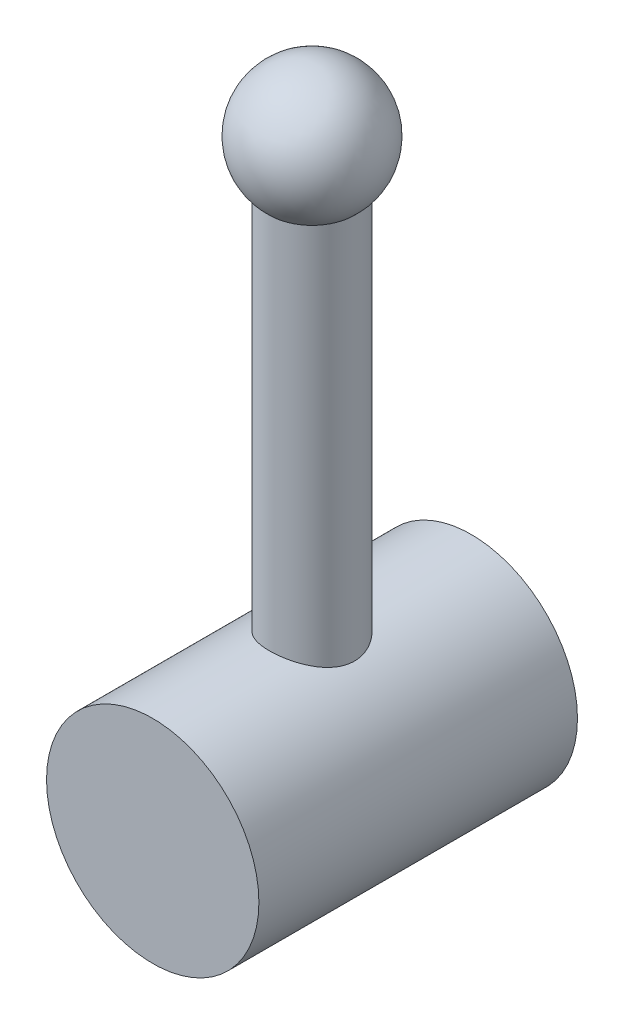
ISO-10303-21;
HEADER;
FILE_DESCRIPTION(('STEP AP214'),'2;1');
FILE_NAME('part.step','',(''),(''),'','','');
FILE_SCHEMA(('AUTOMOTIVE_DESIGN { 1 0 10303 214 1 1 1 1 }'));
ENDSEC;
DATA;
#1=APPLICATION_CONTEXT('core data for automotive mechanical design processes');
#2=APPLICATION_PROTOCOL_DEFINITION('international standard','automotive_design',2000,#1);
#3=PRODUCT_CONTEXT('',#1,'mechanical');
#4=PRODUCT('Part','Part','',(#3));
#5=PRODUCT_RELATED_PRODUCT_CATEGORY('part','',(#4));
#6=PRODUCT_DEFINITION_FORMATION('','',#4);
#7=PRODUCT_DEFINITION_CONTEXT('part definition',#1,'design');
#8=PRODUCT_DEFINITION('design','',#6,#7);
#9=PRODUCT_DEFINITION_SHAPE('','',#8);
#10=(LENGTH_UNIT() NAMED_UNIT(*) SI_UNIT(.MILLI.,.METRE.));
#11=(NAMED_UNIT(*) PLANE_ANGLE_UNIT() SI_UNIT($,.RADIAN.));
#12=(NAMED_UNIT(*) SI_UNIT($,.STERADIAN.) SOLID_ANGLE_UNIT());
#13=UNCERTAINTY_MEASURE_WITH_UNIT(LENGTH_MEASURE(1.E-05),#10,'distance_accuracy_value','');
#14=(GEOMETRIC_REPRESENTATION_CONTEXT(3) GLOBAL_UNCERTAINTY_ASSIGNED_CONTEXT((#13)) GLOBAL_UNIT_ASSIGNED_CONTEXT((#10,
#11,#12)) REPRESENTATION_CONTEXT('',''));
#15=CARTESIAN_POINT('',(0.,0.,0.));
#16=DIRECTION('',(0.,0.,1.));
#17=DIRECTION('',(1.,0.,0.));
#18=AXIS2_PLACEMENT_3D('',#15,#16,#17);
#19=CARTESIAN_POINT('',(0.,50.,15.));
#20=DIRECTION('',(0.,-1.,0.));
#21=DIRECTION('',(0.,0.,-1.));
#22=AXIS2_PLACEMENT_3D('',#19,#20,#21);
#23=CYLINDRICAL_SURFACE('',#22,4.);
#24=CARTESIAN_POINT('',(0.,10.,11.));
#25=CARTESIAN_POINT('',(-0.107549581345536,9.99999886871264,11.0000015749329));
#26=CARTESIAN_POINT('',(-0.215132147940361,9.99825999367799,11.0043436710802));
#27=CARTESIAN_POINT('',(-0.429535200549548,9.99134740691108,11.0216733827839));
#28=CARTESIAN_POINT('',(-0.5363551627033,9.98617152790588,11.0346664534026));
#29=CARTESIAN_POINT('',(-0.748635856497415,9.97250573560117,11.0692080345506));
#30=CARTESIAN_POINT('',(-0.854093134440868,9.96400865312144,11.0907750546198));
#31=CARTESIAN_POINT('',(-1.0626676111401,9.94393017211574,11.1422417304368));
#32=CARTESIAN_POINT('',(-1.16578384227259,9.932347522545,11.1721447662553));
#33=CARTESIAN_POINT('',(-1.46979509681069,9.89349112162205,11.273722808716));
#34=CARTESIAN_POINT('',(-1.66629107461992,9.86204458846134,11.3574218190064));
#35=CARTESIAN_POINT('',(-2.04217417878102,9.79113035538708,11.5540462173498));
#36=CARTESIAN_POINT('',(-2.22156721456798,9.75166544086262,11.6669614601149));
#37=CARTESIAN_POINT('',(-2.56699339938209,9.66661825353092,11.9244687545217));
#38=CARTESIAN_POINT('',(-2.73212223266508,9.62084608086599,12.0702127105756));
#39=CARTESIAN_POINT('',(-3.03635232313263,9.52921139577231,12.386800609152));
#40=CARTESIAN_POINT('',(-3.17544084661153,9.48334885017047,12.5576567590165));
#41=CARTESIAN_POINT('',(-3.42974847409894,9.39445587657958,12.9288559685663));
#42=CARTESIAN_POINT('',(-3.54362978572887,9.35164233015934,13.1301729260637));
#43=CARTESIAN_POINT('',(-3.73550961465234,9.2766729328807,13.5510728428009));
#44=CARTESIAN_POINT('',(-3.81352517485723,9.24451202207146,13.7706470677414));
#45=CARTESIAN_POINT('',(-3.92779760260541,9.19652715590089,14.2114246556858));
#46=CARTESIAN_POINT('',(-3.96578791979826,9.18002840771385,14.4321024680881));
#47=CARTESIAN_POINT('',(-4.00434593508728,9.16328008038143,14.8772699996773));
#48=CARTESIAN_POINT('',(-4.00493203570086,9.16302251073203,15.1017577900111));
#49=CARTESIAN_POINT('',(-3.9699787321474,9.17821000534301,15.5315133422232));
#50=CARTESIAN_POINT('',(-3.93695062778272,9.19256349925666,15.7370314287656));
#51=CARTESIAN_POINT('',(-3.83989376129508,9.23352375055553,16.1393191123503));
#52=CARTESIAN_POINT('',(-3.77585958980135,9.26013264599921,16.3360871763063));
#53=CARTESIAN_POINT('',(-3.6173894649114,9.32318970221162,16.7200356722919));
#54=CARTESIAN_POINT('',(-3.52235972457939,9.35982758573424,16.9069384780825));
#55=CARTESIAN_POINT('',(-3.30501292151569,9.43876232767927,17.26283163275));
#56=CARTESIAN_POINT('',(-3.1826856102159,9.48106130910412,17.4318152188131));
#57=CARTESIAN_POINT('',(-2.90310119889356,9.57053473488081,17.760819457596));
#58=CARTESIAN_POINT('',(-2.74387492593717,9.61783329953252,17.9191374588899));
#59=CARTESIAN_POINT('',(-2.40062885486449,9.70919649915614,18.2073689560062));
#60=CARTESIAN_POINT('',(-2.21660413066998,9.75326048890393,18.3372767948212));
#61=CARTESIAN_POINT('',(-1.82415530521056,9.83429362529359,18.5672348948311));
#62=CARTESIAN_POINT('',(-1.61532098269266,9.87110540190899,18.6666445623939));
#63=CARTESIAN_POINT('',(-1.18204753096606,9.93229656657448,18.8283357221563));
#64=CARTESIAN_POINT('',(-0.957616393699402,9.95668226924746,18.8906360751149));
#65=CARTESIAN_POINT('',(-0.513791775215594,9.98912279013839,18.9728965908394));
#66=CARTESIAN_POINT('',(-0.294886587971144,9.99805891667034,18.9951449085071));
#67=CARTESIAN_POINT('',(0.143690619615703,10.0013695702126,19.0034262010573));
#68=CARTESIAN_POINT('',(0.36336242644818,9.99574787164577,18.9894685630952));
#69=CARTESIAN_POINT('',(0.786865478243653,9.97115134127512,18.9274164948959));
#70=CARTESIAN_POINT('',(0.99096498354976,9.95278782691064,18.8808840392975));
#71=CARTESIAN_POINT('',(1.38827085612275,9.90518882810983,18.757128583381));
#72=CARTESIAN_POINT('',(1.58147582045412,9.87595194712999,18.6799016406648));
#73=CARTESIAN_POINT('',(1.95815757162884,9.80833189541687,18.4944301206379));
#74=CARTESIAN_POINT('',(2.14115604549353,9.76969631959847,18.3853090559053));
#75=CARTESIAN_POINT('',(2.4868871825104,9.68746729490809,18.1401193521971));
#76=CARTESIAN_POINT('',(2.64961168158684,9.64387186219643,18.0040399141861));
#77=CARTESIAN_POINT('',(2.96144608598878,9.55290235277181,17.6982599740674));
#78=CARTESIAN_POINT('',(3.10894786734725,9.50546882853787,17.5269329168592));
#79=CARTESIAN_POINT('',(3.37350239509234,9.41483345830581,17.1611198341097));
#80=CARTESIAN_POINT('',(3.4905501236659,9.37163231039242,16.9666299998006));
#81=CARTESIAN_POINT('',(3.69161500286277,9.2942859982933,16.5570766103267));
#82=CARTESIAN_POINT('',(3.77530118531766,9.26023261821741,16.3418319997565));
#83=CARTESIAN_POINT('',(3.90459244315908,9.20647346903737,15.8985326983872));
#84=CARTESIAN_POINT('',(3.95022562452798,9.18675711197461,15.6704875951582));
#85=CARTESIAN_POINT('',(3.99943122157416,9.16543518780389,15.225744190156));
#86=CARTESIAN_POINT('',(4.0057941177721,9.16262842667612,15.009410298105));
#87=CARTESIAN_POINT('',(3.98360636538274,9.17229671415009,14.5789103072789));
#88=CARTESIAN_POINT('',(3.9550601501471,9.18476982225497,14.3647439367175));
#89=CARTESIAN_POINT('',(3.86614256488129,9.2225330048627,13.9533355391097));
#90=CARTESIAN_POINT('',(3.80707437387706,9.2472967218297,13.7557591537789));
#91=CARTESIAN_POINT('',(3.66001151041638,9.30647993934966,13.3732430382103));
#92=CARTESIAN_POINT('',(3.5720088493455,9.34090210615105,13.1883068148887));
#93=CARTESIAN_POINT('',(3.36374310804133,9.41797252826471,12.8247795892905));
#94=CARTESIAN_POINT('',(3.24192140926543,9.46097893410836,12.6471581693117));
#95=CARTESIAN_POINT('',(2.97179350239177,9.54927479921251,12.3140178573752));
#96=CARTESIAN_POINT('',(2.82347931168581,9.59456494363941,12.15850565271));
#97=CARTESIAN_POINT('',(2.492974124467,9.68587647140965,11.8635764074694));
#98=CARTESIAN_POINT('',(2.30921017071955,9.73175488236393,11.7258566160177));
#99=CARTESIAN_POINT('',(2.01716584575533,9.7949502762577,11.5439518910625));
#100=CARTESIAN_POINT('',(1.91699501972425,9.81509269692655,11.487392936147));
#101=CARTESIAN_POINT('',(1.7118011098248,9.85294835133019,11.3829620045947));
#102=CARTESIAN_POINT('',(1.60678027559742,9.87066269647665,11.335086050192));
#103=CARTESIAN_POINT('',(1.39454646904328,9.9028559935491,11.249252015315));
#104=CARTESIAN_POINT('',(1.28740777135872,9.91738778532477,11.2111298452528));
#105=CARTESIAN_POINT('',(1.06995577523383,9.94319722915714,11.1440786522787));
#106=CARTESIAN_POINT('',(0.95964398335262,9.95447639837582,11.1151453426501));
#107=CARTESIAN_POINT('',(0.736945215856839,9.97343330649399,11.066825163851));
#108=CARTESIAN_POINT('',(0.624564263591285,9.98112017494336,11.047414088355));
#109=CARTESIAN_POINT('',(0.398419132407607,9.99270031578293,11.0182614293338));
#110=CARTESIAN_POINT('',(0.284655994966355,9.99659628445551,11.0085129731657));
#111=CARTESIAN_POINT('',(0.113830463425493,9.99951445883957,11.0012141044266));
#112=CARTESIAN_POINT('',(0.0569198512645304,10.0000005987258,10.9999991664779));
#113=CARTESIAN_POINT('',(0.,10.,11.));
#114=B_SPLINE_CURVE_WITH_KNOTS('',3,(#24,#25,#26,#27,#28,#29,#30,#31,#32,#33,#34,#35,#36,#37,
#38,#39,#40,#41,#42,#43,#44,#45,#46,#47,#48,#49,#50,#51,#52,#53,#54,#55,#56,#57,#58,#59,#60,#61,
#62,#63,#64,#65,#66,#67,#68,#69,#70,#71,#72,#73,#74,#75,#76,#77,#78,#79,#80,#81,#82,#83,#84,#85,
#86,#87,#88,#89,#90,#91,#92,#93,#94,#95,#96,#97,#98,#99,#100,#101,#102,#103,#104,#105,#106,#107,
#108,#109,#110,#111,#112,#113),.UNSPECIFIED.,.T.,.F.,(4,2,2,2,2,2,2,2,2,2,2,2,2,2,2,2,2,2,2,2,2,
2,2,2,2,2,2,2,2,2,2,2,2,2,2,2,2,2,2,2,2,2,2,2,4),(0.,0.322603993422155,0.645411604786481,
0.968919914471234,1.29255959093094,1.93701523385824,2.58124739027476,3.25313995292302,
3.9253602176033,4.62749749529941,5.32930078128043,5.99927442509165,6.66891844572483,
7.29195888698822,7.9151080641227,8.55097484497806,9.18708075776541,9.87235930273289,
10.5577741757964,11.2567305822579,11.9553314412776,12.6125760095619,13.2696501904034,
13.8972014302891,14.5248332988777,15.171662586967,15.8187515089811,16.50856181149,
17.1984856998767,17.8950932218183,18.5911857719204,19.2371857868567,19.8831037702627,
20.5034786899771,21.124025035105,21.7801016801356,22.4363763459696,23.1352007896785,
23.4851924266232,23.8350233218042,24.1785111324565,24.52183846562,24.8642884495951,
25.2064946871486,25.3772305569977),.UNSPECIFIED.);
#115=CARTESIAN_POINT('',(0.,10.,11.));
#116=VERTEX_POINT('',#115);
#117=EDGE_CURVE('E45',#116,#116,#114,.T.);
#118=ORIENTED_EDGE('',*,*,#117,.T.);
#119=EDGE_LOOP('',(#118));
#120=FACE_BOUND('',#119,.T.);
#121=CARTESIAN_POINT('',(0.,45.5278640450004,15.));
#122=DIRECTION('',(0.,1.,0.));
#123=DIRECTION('',(0.,0.,1.));
#124=AXIS2_PLACEMENT_3D('',#121,#122,#123);
#125=CIRCLE('',#124,4.);
#126=CARTESIAN_POINT('',(0.,45.5278640450004,19.));
#127=VERTEX_POINT('',#126);
#128=EDGE_CURVE('E10',#127,#127,#125,.T.);
#129=ORIENTED_EDGE('',*,*,#128,.F.);
#130=EDGE_LOOP('',(#129));
#131=FACE_BOUND('',#130,.T.);
#132=ADVANCED_FACE('F37',(#120,#131),#23,.T.);
#133=CARTESIAN_POINT('',(0.,0.,30.));
#134=DIRECTION('',(0.,0.,-1.));
#135=DIRECTION('',(-1.,0.,0.));
#136=AXIS2_PLACEMENT_3D('',#133,#134,#135);
#137=CYLINDRICAL_SURFACE('',#136,10.);
#138=CARTESIAN_POINT('',(0.,0.,30.));
#139=DIRECTION('',(0.,0.,1.));
#140=DIRECTION('',(1.,0.,0.));
#141=AXIS2_PLACEMENT_3D('',#138,#139,#140);
#142=CIRCLE('',#141,10.);
#143=CARTESIAN_POINT('',(10.,0.,30.));
#144=VERTEX_POINT('',#143);
#145=EDGE_CURVE('E49',#144,#144,#142,.T.);
#146=ORIENTED_EDGE('',*,*,#145,.F.);
#147=EDGE_LOOP('',(#146));
#148=FACE_BOUND('',#147,.T.);
#149=CARTESIAN_POINT('',(0.,0.,0.));
#150=DIRECTION('',(0.,0.,1.));
#151=DIRECTION('',(1.,0.,0.));
#152=AXIS2_PLACEMENT_3D('',#149,#150,#151);
#153=CIRCLE('',#152,10.);
#154=CARTESIAN_POINT('',(10.,0.,0.));
#155=VERTEX_POINT('',#154);
#156=EDGE_CURVE('E53',#155,#155,#153,.T.);
#157=ORIENTED_EDGE('',*,*,#156,.T.);
#158=EDGE_LOOP('',(#157));
#159=FACE_BOUND('',#158,.T.);
#160=ORIENTED_EDGE('',*,*,#117,.F.);
#161=EDGE_LOOP('',(#160));
#162=FACE_BOUND('',#161,.T.);
#163=ADVANCED_FACE('F39',(#148,#159,#162),#137,.T.);
#164=CARTESIAN_POINT('',(0.,0.,30.));
#165=DIRECTION('',(0.,0.,1.));
#166=DIRECTION('',(1.,0.,0.));
#167=AXIS2_PLACEMENT_3D('',#164,#165,#166);
#168=PLANE('',#167);
#169=ORIENTED_EDGE('',*,*,#145,.T.);
#170=EDGE_LOOP('',(#169));
#171=FACE_BOUND('',#170,.T.);
#172=ADVANCED_FACE('F65',(#171),#168,.T.);
#173=CARTESIAN_POINT('',(0.,0.,0.));
#174=DIRECTION('',(0.,0.,1.));
#175=DIRECTION('',(1.,0.,0.));
#176=AXIS2_PLACEMENT_3D('',#173,#174,#175);
#177=PLANE('',#176);
#178=ORIENTED_EDGE('',*,*,#156,.F.);
#179=EDGE_LOOP('',(#178));
#180=FACE_BOUND('',#179,.T.);
#181=ADVANCED_FACE('F67',(#180),#177,.F.);
#182=CARTESIAN_POINT('',(0.,50.,15.));
#183=DIRECTION('',(0.,0.,-1.));
#184=DIRECTION('',(1.,0.,0.));
#185=AXIS2_PLACEMENT_3D('',#182,#183,#184);
#186=SPHERICAL_SURFACE('',#185,6.);
#187=CARTESIAN_POINT('',(0.,50.,15.));
#188=DIRECTION('',(0.,1.,0.));
#189=DIRECTION('',(0.,0.,1.));
#190=AXIS2_PLACEMENT_3D('',#187,#188,#189);
#191=SPHERICAL_SURFACE('',#190,6.);
#192=ORIENTED_EDGE('',*,*,#128,.T.);
#193=EDGE_LOOP('',(#192));
#194=FACE_BOUND('',#193,.T.);
#195=ADVANCED_FACE('F64',(#194),#191,.T.);
#196=CLOSED_SHELL('',(#132,#163,#172,#181,#195));
#197=MANIFOLD_SOLID_BREP('B2',#196);
#198=ADVANCED_BREP_SHAPE_REPRESENTATION('',(#18,#197),#14);
#199=SHAPE_DEFINITION_REPRESENTATION(#9,#198);
ENDSEC;
END-ISO-10303-21;
